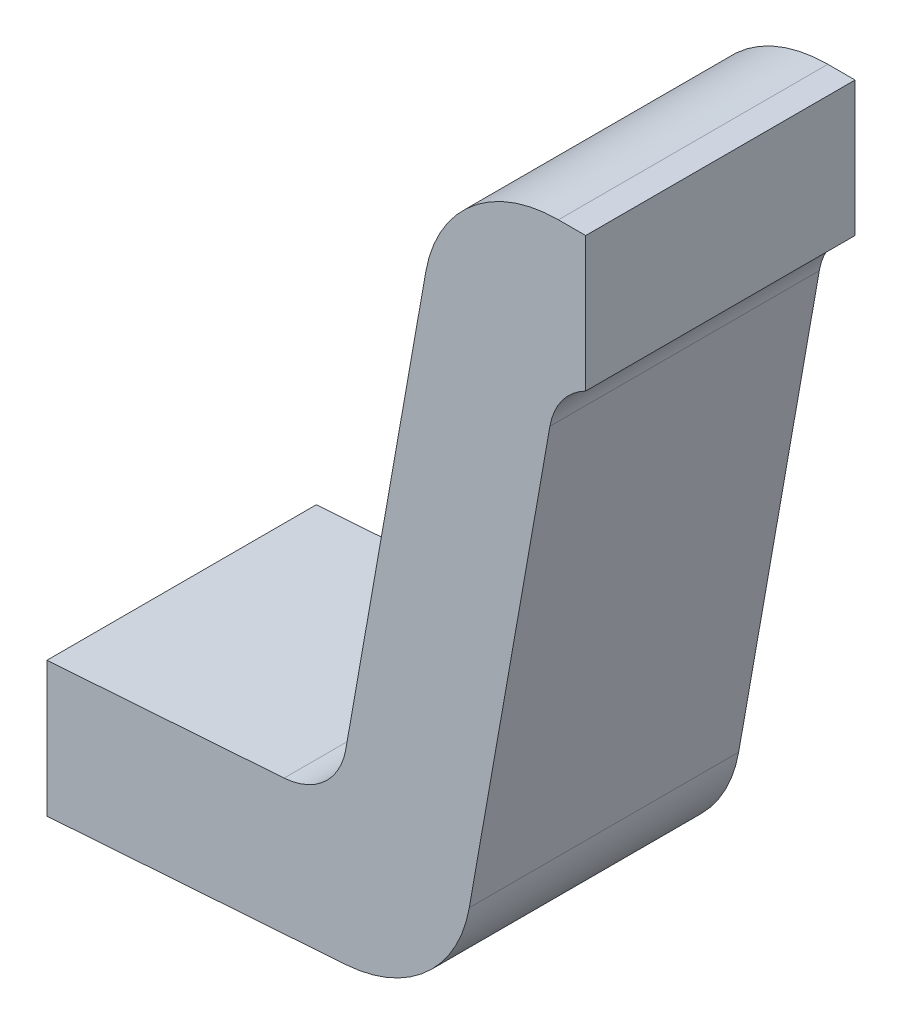
ISO-10303-21;
HEADER;
FILE_DESCRIPTION(('STEP AP214'),'2;1');
FILE_NAME('part.step','',(''),(''),'','','');
FILE_SCHEMA(('AUTOMOTIVE_DESIGN { 1 0 10303 214 1 1 1 1 }'));
ENDSEC;
DATA;
#1=APPLICATION_CONTEXT('core data for automotive mechanical design processes');
#2=APPLICATION_PROTOCOL_DEFINITION('international standard','automotive_design',2000,#1);
#3=PRODUCT_CONTEXT('',#1,'mechanical');
#4=PRODUCT('Part','Part','',(#3));
#5=PRODUCT_RELATED_PRODUCT_CATEGORY('part','',(#4));
#6=PRODUCT_DEFINITION_FORMATION('','',#4);
#7=PRODUCT_DEFINITION_CONTEXT('part definition',#1,'design');
#8=PRODUCT_DEFINITION('design','',#6,#7);
#9=PRODUCT_DEFINITION_SHAPE('','',#8);
#10=(LENGTH_UNIT() NAMED_UNIT(*) SI_UNIT(.MILLI.,.METRE.));
#11=(NAMED_UNIT(*) PLANE_ANGLE_UNIT() SI_UNIT($,.RADIAN.));
#12=(NAMED_UNIT(*) SI_UNIT($,.STERADIAN.) SOLID_ANGLE_UNIT());
#13=UNCERTAINTY_MEASURE_WITH_UNIT(LENGTH_MEASURE(1.E-05),#10,'distance_accuracy_value','');
#14=(GEOMETRIC_REPRESENTATION_CONTEXT(3) GLOBAL_UNCERTAINTY_ASSIGNED_CONTEXT((#13)) GLOBAL_UNIT_ASSIGNED_CONTEXT((#10,
#11,#12)) REPRESENTATION_CONTEXT('',''));
#15=CARTESIAN_POINT('',(0.,0.,0.));
#16=DIRECTION('',(0.,0.,1.));
#17=DIRECTION('',(1.,0.,0.));
#18=AXIS2_PLACEMENT_3D('',#15,#16,#17);
#19=CARTESIAN_POINT('',(0.363112734969,0.362554628123,0.));
#20=DIRECTION('',(0.,0.,1.));
#21=DIRECTION('',(1.,0.,0.));
#22=AXIS2_PLACEMENT_3D('',#19,#20,#21);
#23=PLANE('',#22);
#24=DIRECTION('',(0.997564050259825,0.0697564737441177,0.));
#25=VECTOR('',#24,1.);
#26=CARTESIAN_POINT('',(0.,0.,0.));
#27=LINE('',#26,#25);
#28=CARTESIAN_POINT('',(0.,0.,0.));
#29=VERTEX_POINT('',#28);
#30=CARTESIAN_POINT('',(0.333092631901818,0.0232921058307648,0.));
#31=VERTEX_POINT('',#30);
#32=EDGE_CURVE('E100',#29,#31,#27,.T.);
#33=ORIENTED_EDGE('',*,*,#32,.F.);
#34=DIRECTION('',(0.,-1.,0.));
#35=VECTOR('',#34,1.);
#36=CARTESIAN_POINT('',(0.,0.150366284712,0.));
#37=LINE('',#36,#35);
#38=CARTESIAN_POINT('',(0.,0.15036628471215,0.));
#39=VERTEX_POINT('',#38);
#40=EDGE_CURVE('E124',#39,#29,#37,.T.);
#41=ORIENTED_EDGE('',*,*,#40,.F.);
#42=DIRECTION('',(-0.997564050259825,-0.0697564737441177,0.));
#43=VECTOR('',#42,1.);
#44=CARTESIAN_POINT('',(0.32262916084,0.17292671337,0.));
#45=LINE('',#44,#43);
#46=CARTESIAN_POINT('',(0.264175476790881,0.168839233598092,0.));
#47=VERTEX_POINT('',#46);
#48=EDGE_CURVE('E126',#47,#39,#45,.T.);
#49=ORIENTED_EDGE('',*,*,#48,.F.);
#50=CARTESIAN_POINT('',(0.25894374126,0.243656537367,0.));
#51=DIRECTION('',(0.,0.,1.));
#52=DIRECTION('',(1.,0.,0.));
#53=AXIS2_PLACEMENT_3D('',#50,#51,#52);
#54=CIRCLE('',#53,0.075);
#55=CARTESIAN_POINT('',(0.332804322735929,0.230632924041991,0.));
#56=VERTEX_POINT('',#55);
#57=EDGE_CURVE('E165',#47,#56,#54,.T.);
#58=ORIENTED_EDGE('',*,*,#57,.T.);
#59=DIRECTION('',(-0.173648177667033,-0.98480775301219,0.));
#60=VECTOR('',#59,1.);
#61=CARTESIAN_POINT('',(0.443778718997,0.86,0.));
#62=LINE('',#61,#60);
#63=CARTESIAN_POINT('',(0.421922500721756,0.736047226650086,0.));
#64=VERTEX_POINT('',#63);
#65=EDGE_CURVE('E134',#64,#56,#62,.T.);
#66=ORIENTED_EDGE('',*,*,#65,.F.);
#67=CARTESIAN_POINT('',(0.569643663674,0.71,0.));
#68=DIRECTION('',(0.,0.,1.));
#69=DIRECTION('',(1.,0.,0.));
#70=AXIS2_PLACEMENT_3D('',#67,#68,#69);
#71=CIRCLE('',#70,0.15);
#72=CARTESIAN_POINT('',(0.569643663674,0.86,0.));
#73=VERTEX_POINT('',#72);
#74=EDGE_CURVE('E168',#73,#64,#71,.T.);
#75=ORIENTED_EDGE('',*,*,#74,.F.);
#76=DIRECTION('',(1.,0.,0.));
#77=VECTOR('',#76,1.);
#78=CARTESIAN_POINT('',(0.6,0.86,0.));
#79=LINE('',#78,#77);
#80=CARTESIAN_POINT('',(0.6,0.86,0.));
#81=VERTEX_POINT('',#80);
#82=EDGE_CURVE('E138',#81,#73,#79,.F.);
#83=ORIENTED_EDGE('',*,*,#82,.F.);
#84=DIRECTION('',(0.,1.,0.));
#85=VECTOR('',#84,1.);
#86=CARTESIAN_POINT('',(0.6,0.71,0.));
#87=LINE('',#86,#85);
#88=CARTESIAN_POINT('',(0.6,0.710000000000019,0.));
#89=VERTEX_POINT('',#88);
#90=EDGE_CURVE('E144',#89,#81,#87,.T.);
#91=ORIENTED_EDGE('',*,*,#90,.F.);
#92=CARTESIAN_POINT('',(0.634014389479,0.643156740741,0.));
#93=DIRECTION('',(0.,0.,1.));
#94=DIRECTION('',(1.,0.,0.));
#95=AXIS2_PLACEMENT_3D('',#92,#93,#94);
#96=CIRCLE('',#95,0.075);
#97=CARTESIAN_POINT('',(0.560153808003276,0.656180354065973,0.));
#98=VERTEX_POINT('',#97);
#99=EDGE_CURVE('E151',#89,#98,#96,.T.);
#100=ORIENTED_EDGE('',*,*,#99,.T.);
#101=DIRECTION('',(0.173648177667033,0.98480775301219,0.));
#102=VECTOR('',#101,1.);
#103=CARTESIAN_POINT('',(0.45,0.03146706537458,0.));
#104=LINE('',#103,#102);
#105=CARTESIAN_POINT('',(0.470350323792093,0.146879486719941,0.));
#106=VERTEX_POINT('',#105);
#107=EDGE_CURVE('E102',#106,#98,#104,.T.);
#108=ORIENTED_EDGE('',*,*,#107,.F.);
#109=CARTESIAN_POINT('',(0.32262916084,0.17292671337,0.));
#110=DIRECTION('',(0.,0.,1.));
#111=DIRECTION('',(1.,0.,0.));
#112=AXIS2_PLACEMENT_3D('',#109,#110,#111);
#113=CIRCLE('',#112,0.15);
#114=EDGE_CURVE('E20',#31,#106,#113,.T.);
#115=ORIENTED_EDGE('',*,*,#114,.F.);
#116=EDGE_LOOP('',(#33,#41,#49,#58,#66,#75,#83,#91,#100,#108,#115));
#117=FACE_BOUND('',#116,.T.);
#118=ADVANCED_FACE('F17',(#117),#23,.F.);
#119=CARTESIAN_POINT('',(0.32262916084,0.17292671337,0.));
#120=DIRECTION('',(0.,0.,1.));
#121=DIRECTION('',(1.,0.,0.));
#122=AXIS2_PLACEMENT_3D('',#119,#120,#121);
#123=CYLINDRICAL_SURFACE('',#122,0.15);
#124=ORIENTED_EDGE('',*,*,#114,.T.);
#125=DIRECTION('',(0.,0.,1.));
#126=VECTOR('',#125,1.);
#127=CARTESIAN_POINT('',(0.4703503237921,0.146879486719982,0.));
#128=LINE('',#127,#126);
#129=CARTESIAN_POINT('',(0.470350323792052,0.146879486720003,0.3));
#130=VERTEX_POINT('',#129);
#131=EDGE_CURVE('E105',#130,#106,#128,.F.);
#132=ORIENTED_EDGE('',*,*,#131,.F.);
#133=CARTESIAN_POINT('',(0.32262916084,0.17292671337,0.3));
#134=DIRECTION('',(0.,0.,1.));
#135=DIRECTION('',(1.,0.,0.));
#136=AXIS2_PLACEMENT_3D('',#133,#134,#135);
#137=CIRCLE('',#136,0.15);
#138=CARTESIAN_POINT('',(0.333092631901817,0.023292105830761,0.3));
#139=VERTEX_POINT('',#138);
#140=EDGE_CURVE('E110',#139,#130,#137,.T.);
#141=ORIENTED_EDGE('',*,*,#140,.F.);
#142=DIRECTION('',(0.,0.,1.));
#143=VECTOR('',#142,1.);
#144=CARTESIAN_POINT('',(0.333092631901999,0.0232921058307775,0.));
#145=LINE('',#144,#143);
#146=EDGE_CURVE('E107',#31,#139,#145,.T.);
#147=ORIENTED_EDGE('',*,*,#146,.F.);
#148=EDGE_LOOP('',(#124,#132,#141,#147));
#149=FACE_BOUND('',#148,.T.);
#150=ADVANCED_FACE('F108',(#149),#123,.T.);
#151=CARTESIAN_POINT('',(0.45,0.03146706537458,0.));
#152=DIRECTION('',(0.98480775301219,-0.173648177667033,0.));
#153=DIRECTION('',(0.173648177667033,0.98480775301219,0.));
#154=AXIS2_PLACEMENT_3D('',#151,#152,#153);
#155=PLANE('',#154);
#156=ORIENTED_EDGE('',*,*,#131,.T.);
#157=ORIENTED_EDGE('',*,*,#107,.T.);
#158=DIRECTION('',(0.,0.,1.));
#159=VECTOR('',#158,1.);
#160=CARTESIAN_POINT('',(0.560153808003078,0.656180354065986,0.));
#161=LINE('',#160,#159);
#162=CARTESIAN_POINT('',(0.560153808003038,0.656180354065987,0.3));
#163=VERTEX_POINT('',#162);
#164=EDGE_CURVE('E147',#98,#163,#161,.T.);
#165=ORIENTED_EDGE('',*,*,#164,.T.);
#166=DIRECTION('',(0.173648177666325,0.984807753012315,0.));
#167=VECTOR('',#166,1.);
#168=CARTESIAN_POINT('',(0.470350323792,0.14687948672,0.3));
#169=LINE('',#168,#167);
#170=EDGE_CURVE('E116',#130,#163,#169,.T.);
#171=ORIENTED_EDGE('',*,*,#170,.F.);
#172=EDGE_LOOP('',(#156,#157,#165,#171));
#173=FACE_BOUND('',#172,.T.);
#174=ADVANCED_FACE('F315',(#173),#155,.T.);
#175=CARTESIAN_POINT('',(0.634014389479,0.643156740741,0.));
#176=DIRECTION('',(0.,0.,1.));
#177=DIRECTION('',(1.,0.,0.));
#178=AXIS2_PLACEMENT_3D('',#175,#176,#177);
#179=CYLINDRICAL_SURFACE('',#178,0.075);
#180=ORIENTED_EDGE('',*,*,#164,.F.);
#181=ORIENTED_EDGE('',*,*,#99,.F.);
#182=DIRECTION('',(0.,0.,1.));
#183=VECTOR('',#182,1.);
#184=CARTESIAN_POINT('',(0.6,0.71,0.));
#185=LINE('',#184,#183);
#186=CARTESIAN_POINT('',(0.6,0.710000000000019,0.3));
#187=VERTEX_POINT('',#186);
#188=EDGE_CURVE('E146',#187,#89,#185,.F.);
#189=ORIENTED_EDGE('',*,*,#188,.F.);
#190=CARTESIAN_POINT('',(0.634014389479,0.643156740741,0.3));
#191=DIRECTION('',(0.,0.,1.));
#192=DIRECTION('',(1.,0.,0.));
#193=AXIS2_PLACEMENT_3D('',#190,#191,#192);
#194=CIRCLE('',#193,0.075);
#195=EDGE_CURVE('E161',#163,#187,#194,.F.);
#196=ORIENTED_EDGE('',*,*,#195,.F.);
#197=EDGE_LOOP('',(#180,#181,#189,#196));
#198=FACE_BOUND('',#197,.T.);
#199=ADVANCED_FACE('F305',(#198),#179,.F.);
#200=CARTESIAN_POINT('',(0.6,0.71,0.));
#201=DIRECTION('',(1.,0.,0.));
#202=DIRECTION('',(0.,1.,0.));
#203=AXIS2_PLACEMENT_3D('',#200,#201,#202);
#204=PLANE('',#203);
#205=DIRECTION('',(0.,1.,0.));
#206=VECTOR('',#205,1.);
#207=CARTESIAN_POINT('',(0.6,0.362554628123,0.3));
#208=LINE('',#207,#206);
#209=CARTESIAN_POINT('',(0.6,0.86,0.3));
#210=VERTEX_POINT('',#209);
#211=EDGE_CURVE('E163',#187,#210,#208,.T.);
#212=ORIENTED_EDGE('',*,*,#211,.F.);
#213=ORIENTED_EDGE('',*,*,#188,.T.);
#214=ORIENTED_EDGE('',*,*,#90,.T.);
#215=DIRECTION('',(0.,0.,1.));
#216=VECTOR('',#215,1.);
#217=CARTESIAN_POINT('',(0.6,0.86,0.));
#218=LINE('',#217,#216);
#219=EDGE_CURVE('E141',#210,#81,#218,.F.);
#220=ORIENTED_EDGE('',*,*,#219,.F.);
#221=EDGE_LOOP('',(#212,#213,#214,#220));
#222=FACE_BOUND('',#221,.T.);
#223=ADVANCED_FACE('F295',(#222),#204,.T.);
#224=CARTESIAN_POINT('',(0.6,0.86,0.));
#225=DIRECTION('',(0.,1.,0.));
#226=DIRECTION('',(0.,0.,1.));
#227=AXIS2_PLACEMENT_3D('',#224,#225,#226);
#228=PLANE('',#227);
#229=ORIENTED_EDGE('',*,*,#219,.T.);
#230=ORIENTED_EDGE('',*,*,#82,.T.);
#231=DIRECTION('',(0.,0.,1.));
#232=VECTOR('',#231,1.);
#233=CARTESIAN_POINT('',(0.569643663674,0.86,0.));
#234=LINE('',#233,#232);
#235=CARTESIAN_POINT('',(0.569643663674,0.86,0.3));
#236=VERTEX_POINT('',#235);
#237=EDGE_CURVE('E140',#236,#73,#234,.F.);
#238=ORIENTED_EDGE('',*,*,#237,.F.);
#239=DIRECTION('',(1.,0.,0.));
#240=VECTOR('',#239,1.);
#241=CARTESIAN_POINT('',(0.363112734969,0.86,0.3));
#242=LINE('',#241,#240);
#243=EDGE_CURVE('E160',#210,#236,#242,.F.);
#244=ORIENTED_EDGE('',*,*,#243,.F.);
#245=EDGE_LOOP('',(#229,#230,#238,#244));
#246=FACE_BOUND('',#245,.T.);
#247=ADVANCED_FACE('F285',(#246),#228,.T.);
#248=CARTESIAN_POINT('',(0.569643663674,0.71,0.));
#249=DIRECTION('',(0.,0.,1.));
#250=DIRECTION('',(1.,0.,0.));
#251=AXIS2_PLACEMENT_3D('',#248,#249,#250);
#252=CYLINDRICAL_SURFACE('',#251,0.15);
#253=ORIENTED_EDGE('',*,*,#74,.T.);
#254=DIRECTION('',(0.,0.,1.));
#255=VECTOR('',#254,1.);
#256=CARTESIAN_POINT('',(0.421922500721748,0.736047226650044,0.));
#257=LINE('',#256,#255);
#258=CARTESIAN_POINT('',(0.421922500721886,0.736047226650092,0.3));
#259=VERTEX_POINT('',#258);
#260=EDGE_CURVE('E137',#259,#64,#257,.F.);
#261=ORIENTED_EDGE('',*,*,#260,.F.);
#262=CARTESIAN_POINT('',(0.569643663674,0.71,0.3));
#263=DIRECTION('',(0.,0.,1.));
#264=DIRECTION('',(1.,0.,0.));
#265=AXIS2_PLACEMENT_3D('',#262,#263,#264);
#266=CIRCLE('',#265,0.15);
#267=EDGE_CURVE('E157',#236,#259,#266,.T.);
#268=ORIENTED_EDGE('',*,*,#267,.F.);
#269=ORIENTED_EDGE('',*,*,#237,.T.);
#270=EDGE_LOOP('',(#253,#261,#268,#269));
#271=FACE_BOUND('',#270,.T.);
#272=ADVANCED_FACE('F275',(#271),#252,.T.);
#273=CARTESIAN_POINT('',(0.443778718997,0.86,0.));
#274=DIRECTION('',(-0.98480775301219,0.173648177667033,0.));
#275=DIRECTION('',(-0.173648177667033,-0.98480775301219,0.));
#276=AXIS2_PLACEMENT_3D('',#273,#274,#275);
#277=PLANE('',#276);
#278=ORIENTED_EDGE('',*,*,#260,.T.);
#279=ORIENTED_EDGE('',*,*,#65,.T.);
#280=DIRECTION('',(0.,0.,1.));
#281=VECTOR('',#280,1.);
#282=CARTESIAN_POINT('',(0.332804322735922,0.230632924042014,0.));
#283=LINE('',#282,#281);
#284=CARTESIAN_POINT('',(0.332804322735955,0.230632924041972,0.3));
#285=VERTEX_POINT('',#284);
#286=EDGE_CURVE('E136',#56,#285,#283,.T.);
#287=ORIENTED_EDGE('',*,*,#286,.T.);
#288=DIRECTION('',(-0.173648177667416,-0.984807753012123,0.));
#289=VECTOR('',#288,1.);
#290=CARTESIAN_POINT('',(0.421922500722,0.73604722665,0.3));
#291=LINE('',#290,#289);
#292=EDGE_CURVE('E156',#259,#285,#291,.T.);
#293=ORIENTED_EDGE('',*,*,#292,.F.);
#294=EDGE_LOOP('',(#278,#279,#287,#293));
#295=FACE_BOUND('',#294,.T.);
#296=ADVANCED_FACE('F265',(#295),#277,.T.);
#297=CARTESIAN_POINT('',(0.25894374126,0.243656537367,0.));
#298=DIRECTION('',(0.,0.,1.));
#299=DIRECTION('',(1.,0.,0.));
#300=AXIS2_PLACEMENT_3D('',#297,#298,#299);
#301=CYLINDRICAL_SURFACE('',#300,0.075);
#302=DIRECTION('',(0.,0.,1.));
#303=VECTOR('',#302,1.);
#304=CARTESIAN_POINT('',(0.264175476790993,0.1688392335981,0.));
#305=LINE('',#304,#303);
#306=CARTESIAN_POINT('',(0.264175476790934,0.168839233598046,0.3));
#307=VERTEX_POINT('',#306);
#308=EDGE_CURVE('E131',#307,#47,#305,.F.);
#309=ORIENTED_EDGE('',*,*,#308,.F.);
#310=CARTESIAN_POINT('',(0.25894374126,0.243656537367,0.3));
#311=DIRECTION('',(0.,0.,1.));
#312=DIRECTION('',(1.,0.,0.));
#313=AXIS2_PLACEMENT_3D('',#310,#311,#312);
#314=CIRCLE('',#313,0.075);
#315=EDGE_CURVE('E152',#285,#307,#314,.F.);
#316=ORIENTED_EDGE('',*,*,#315,.F.);
#317=ORIENTED_EDGE('',*,*,#286,.F.);
#318=ORIENTED_EDGE('',*,*,#57,.F.);
#319=EDGE_LOOP('',(#309,#316,#317,#318));
#320=FACE_BOUND('',#319,.T.);
#321=ADVANCED_FACE('F231',(#320),#301,.F.);
#322=CARTESIAN_POINT('',(0.32262916084,0.17292671337,0.));
#323=DIRECTION('',(-0.0697564737441177,0.997564050259825,0.));
#324=DIRECTION('',(-0.997564050259825,-0.0697564737441177,0.));
#325=AXIS2_PLACEMENT_3D('',#322,#323,#324);
#326=PLANE('',#325);
#327=DIRECTION('',(0.,0.,1.));
#328=VECTOR('',#327,1.);
#329=CARTESIAN_POINT('',(0.,0.150366284712,0.));
#330=LINE('',#329,#328);
#331=CARTESIAN_POINT('',(0.,0.150366284712,0.3));
#332=VERTEX_POINT('',#331);
#333=EDGE_CURVE('E112',#332,#39,#330,.F.);
#334=ORIENTED_EDGE('',*,*,#333,.F.);
#335=DIRECTION('',(-0.997564050259733,-0.0697564737454349,0.));
#336=VECTOR('',#335,1.);
#337=CARTESIAN_POINT('',(0.264175476791,0.168839233598,0.3));
#338=LINE('',#337,#336);
#339=EDGE_CURVE('E155',#307,#332,#338,.T.);
#340=ORIENTED_EDGE('',*,*,#339,.F.);
#341=ORIENTED_EDGE('',*,*,#308,.T.);
#342=ORIENTED_EDGE('',*,*,#48,.T.);
#343=EDGE_LOOP('',(#334,#340,#341,#342));
#344=FACE_BOUND('',#343,.T.);
#345=ADVANCED_FACE('F220',(#344),#326,.T.);
#346=CARTESIAN_POINT('',(0.,0.150366284712,0.));
#347=DIRECTION('',(-1.,0.,0.));
#348=DIRECTION('',(0.,-1.,0.));
#349=AXIS2_PLACEMENT_3D('',#346,#347,#348);
#350=PLANE('',#349);
#351=DIRECTION('',(0.,1.,0.));
#352=VECTOR('',#351,1.);
#353=CARTESIAN_POINT('',(0.,0.362554628123,0.3));
#354=LINE('',#353,#352);
#355=CARTESIAN_POINT('',(0.,0.,0.3));
#356=VERTEX_POINT('',#355);
#357=EDGE_CURVE('E26',#332,#356,#354,.F.);
#358=ORIENTED_EDGE('',*,*,#357,.F.);
#359=ORIENTED_EDGE('',*,*,#333,.T.);
#360=ORIENTED_EDGE('',*,*,#40,.T.);
#361=DIRECTION('',(0.,0.,1.));
#362=VECTOR('',#361,1.);
#363=CARTESIAN_POINT('',(0.,0.,0.));
#364=LINE('',#363,#362);
#365=EDGE_CURVE('E35',#356,#29,#364,.F.);
#366=ORIENTED_EDGE('',*,*,#365,.F.);
#367=EDGE_LOOP('',(#358,#359,#360,#366));
#368=FACE_BOUND('',#367,.T.);
#369=ADVANCED_FACE('F222',(#368),#350,.T.);
#370=CARTESIAN_POINT('',(0.,0.,0.));
#371=DIRECTION('',(0.0697564737441177,-0.997564050259825,0.));
#372=DIRECTION('',(0.997564050259825,0.0697564737441177,0.));
#373=AXIS2_PLACEMENT_3D('',#370,#371,#372);
#374=PLANE('',#373);
#375=ORIENTED_EDGE('',*,*,#365,.T.);
#376=ORIENTED_EDGE('',*,*,#32,.T.);
#377=ORIENTED_EDGE('',*,*,#146,.T.);
#378=DIRECTION('',(0.997564050259826,0.0697564737440952,0.));
#379=VECTOR('',#378,1.);
#380=CARTESIAN_POINT('',(0.,0.,0.3));
#381=LINE('',#380,#379);
#382=EDGE_CURVE('E11',#356,#139,#381,.T.);
#383=ORIENTED_EDGE('',*,*,#382,.F.);
#384=EDGE_LOOP('',(#375,#376,#377,#383));
#385=FACE_BOUND('',#384,.T.);
#386=ADVANCED_FACE('F114',(#385),#374,.T.);
#387=CARTESIAN_POINT('',(0.363112734969,0.362554628123,0.3));
#388=DIRECTION('',(0.,0.,1.));
#389=DIRECTION('',(1.,0.,0.));
#390=AXIS2_PLACEMENT_3D('',#387,#388,#389);
#391=PLANE('',#390);
#392=ORIENTED_EDGE('',*,*,#357,.T.);
#393=ORIENTED_EDGE('',*,*,#382,.T.);
#394=ORIENTED_EDGE('',*,*,#140,.T.);
#395=ORIENTED_EDGE('',*,*,#170,.T.);
#396=ORIENTED_EDGE('',*,*,#195,.T.);
#397=ORIENTED_EDGE('',*,*,#211,.T.);
#398=ORIENTED_EDGE('',*,*,#243,.T.);
#399=ORIENTED_EDGE('',*,*,#267,.T.);
#400=ORIENTED_EDGE('',*,*,#292,.T.);
#401=ORIENTED_EDGE('',*,*,#315,.T.);
#402=ORIENTED_EDGE('',*,*,#339,.T.);
#403=EDGE_LOOP('',(#392,#393,#394,#395,#396,#397,#398,#399,#400,#401,#402));
#404=FACE_BOUND('',#403,.T.);
#405=ADVANCED_FACE('F217',(#404),#391,.T.);
#406=CLOSED_SHELL('',(#118,#150,#174,#199,#223,#247,#272,#296,#321,#345,#369,#386,#405));
#407=MANIFOLD_SOLID_BREP('B1',#406);
#408=ADVANCED_BREP_SHAPE_REPRESENTATION('',(#18,#407),#14);
#409=SHAPE_DEFINITION_REPRESENTATION(#9,#408);
ENDSEC;
END-ISO-10303-21;
